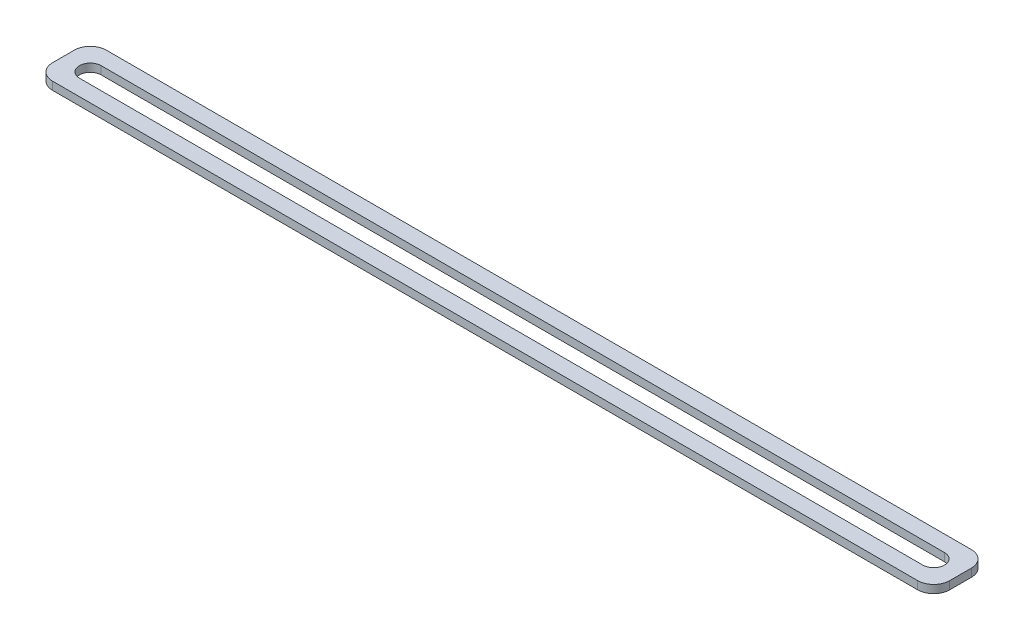
ISO-10303-21;
HEADER;
FILE_DESCRIPTION(('STEP AP214'),'2;1');
FILE_NAME('part.step','',(''),(''),'','','');
FILE_SCHEMA(('AUTOMOTIVE_DESIGN { 1 0 10303 214 1 1 1 1 }'));
ENDSEC;
DATA;
#1=APPLICATION_CONTEXT('core data for automotive mechanical design processes');
#2=APPLICATION_PROTOCOL_DEFINITION('international standard','automotive_design',2000,#1);
#3=PRODUCT_CONTEXT('',#1,'mechanical');
#4=PRODUCT('Part','Part','',(#3));
#5=PRODUCT_RELATED_PRODUCT_CATEGORY('part','',(#4));
#6=PRODUCT_DEFINITION_FORMATION('','',#4);
#7=PRODUCT_DEFINITION_CONTEXT('part definition',#1,'design');
#8=PRODUCT_DEFINITION('design','',#6,#7);
#9=PRODUCT_DEFINITION_SHAPE('','',#8);
#10=(LENGTH_UNIT() NAMED_UNIT(*) SI_UNIT(.MILLI.,.METRE.));
#11=(NAMED_UNIT(*) PLANE_ANGLE_UNIT() SI_UNIT($,.RADIAN.));
#12=(NAMED_UNIT(*) SI_UNIT($,.STERADIAN.) SOLID_ANGLE_UNIT());
#13=UNCERTAINTY_MEASURE_WITH_UNIT(LENGTH_MEASURE(1.E-05),#10,'distance_accuracy_value','');
#14=(GEOMETRIC_REPRESENTATION_CONTEXT(3) GLOBAL_UNCERTAINTY_ASSIGNED_CONTEXT((#13)) GLOBAL_UNIT_ASSIGNED_CONTEXT((#10,
#11,#12)) REPRESENTATION_CONTEXT('',''));
#15=CARTESIAN_POINT('',(0.,0.,0.));
#16=DIRECTION('',(0.,0.,1.));
#17=DIRECTION('',(1.,0.,0.));
#18=AXIS2_PLACEMENT_3D('',#15,#16,#17);
#19=CARTESIAN_POINT('',(0.,1.5875,0.));
#20=DIRECTION('',(0.,-1.,0.));
#21=DIRECTION('',(0.,0.,-1.));
#22=AXIS2_PLACEMENT_3D('',#19,#20,#21);
#23=PLANE('',#22);
#24=DIRECTION('',(0.,0.,-1.));
#25=VECTOR('',#24,1.);
#26=CARTESIAN_POINT('',(88.9,1.5875,5.325));
#27=LINE('',#26,#25);
#28=CARTESIAN_POINT('',(88.9,1.5875,2.15));
#29=VERTEX_POINT('',#28);
#30=CARTESIAN_POINT('',(88.9,1.5875,-2.15));
#31=VERTEX_POINT('',#30);
#32=EDGE_CURVE('E176',#29,#31,#27,.T.);
#33=ORIENTED_EDGE('',*,*,#32,.T.);
#34=CARTESIAN_POINT('',(85.725,1.5875,-2.15));
#35=DIRECTION('',(0.,-1.,0.));
#36=DIRECTION('',(0.,0.,-1.));
#37=AXIS2_PLACEMENT_3D('',#34,#35,#36);
#38=CIRCLE('',#37,3.175);
#39=CARTESIAN_POINT('',(85.725,1.5875,-5.325));
#40=VERTEX_POINT('',#39);
#41=EDGE_CURVE('E219',#31,#40,#38,.F.);
#42=ORIENTED_EDGE('',*,*,#41,.T.);
#43=DIRECTION('',(-1.,0.,0.));
#44=VECTOR('',#43,1.);
#45=CARTESIAN_POINT('',(-88.9,1.5875,-5.325));
#46=LINE('',#45,#44);
#47=CARTESIAN_POINT('',(-85.725,1.5875,-5.325));
#48=VERTEX_POINT('',#47);
#49=EDGE_CURVE('E179',#40,#48,#46,.T.);
#50=ORIENTED_EDGE('',*,*,#49,.T.);
#51=CARTESIAN_POINT('',(-85.725,1.5875,-2.15));
#52=DIRECTION('',(0.,-1.,0.));
#53=DIRECTION('',(0.,0.,-1.));
#54=AXIS2_PLACEMENT_3D('',#51,#52,#53);
#55=CIRCLE('',#54,3.175);
#56=CARTESIAN_POINT('',(-88.9,1.5875,-2.15));
#57=VERTEX_POINT('',#56);
#58=EDGE_CURVE('E215',#48,#57,#55,.F.);
#59=ORIENTED_EDGE('',*,*,#58,.T.);
#60=DIRECTION('',(0.,0.,1.));
#61=VECTOR('',#60,1.);
#62=CARTESIAN_POINT('',(-88.9,1.5875,5.325));
#63=LINE('',#62,#61);
#64=CARTESIAN_POINT('',(-88.9,1.5875,2.15));
#65=VERTEX_POINT('',#64);
#66=EDGE_CURVE('E183',#57,#65,#63,.T.);
#67=ORIENTED_EDGE('',*,*,#66,.T.);
#68=CARTESIAN_POINT('',(-85.725,1.5875,2.15));
#69=DIRECTION('',(0.,-1.,0.));
#70=DIRECTION('',(0.,0.,-1.));
#71=AXIS2_PLACEMENT_3D('',#68,#69,#70);
#72=CIRCLE('',#71,3.175);
#73=CARTESIAN_POINT('',(-85.725,1.5875,5.325));
#74=VERTEX_POINT('',#73);
#75=EDGE_CURVE('E65',#65,#74,#72,.F.);
#76=ORIENTED_EDGE('',*,*,#75,.T.);
#77=DIRECTION('',(1.,0.,0.));
#78=VECTOR('',#77,1.);
#79=CARTESIAN_POINT('',(-88.9,1.5875,5.325));
#80=LINE('',#79,#78);
#81=CARTESIAN_POINT('',(85.725,1.5875,5.325));
#82=VERTEX_POINT('',#81);
#83=EDGE_CURVE('E185',#74,#82,#80,.T.);
#84=ORIENTED_EDGE('',*,*,#83,.T.);
#85=CARTESIAN_POINT('',(85.725,1.5875,2.15));
#86=DIRECTION('',(0.,-1.,0.));
#87=DIRECTION('',(0.,0.,-1.));
#88=AXIS2_PLACEMENT_3D('',#85,#86,#87);
#89=CIRCLE('',#88,3.175);
#90=EDGE_CURVE('E217',#82,#29,#89,.F.);
#91=ORIENTED_EDGE('',*,*,#90,.T.);
#92=EDGE_LOOP('',(#33,#42,#50,#59,#67,#76,#84,#91));
#93=FACE_BOUND('',#92,.T.);
#94=CARTESIAN_POINT('',(-83.575,1.5875,0.));
#95=DIRECTION('',(0.,1.,0.));
#96=DIRECTION('',(0.,0.,1.));
#97=AXIS2_PLACEMENT_3D('',#94,#95,#96);
#98=CIRCLE('',#97,2.15);
#99=CARTESIAN_POINT('',(-83.575,1.5875,-2.15));
#100=VERTEX_POINT('',#99);
#101=CARTESIAN_POINT('',(-83.575,1.5875,2.15));
#102=VERTEX_POINT('',#101);
#103=EDGE_CURVE('E135',#100,#102,#98,.T.);
#104=ORIENTED_EDGE('',*,*,#103,.F.);
#105=DIRECTION('',(-1.,0.,0.));
#106=VECTOR('',#105,1.);
#107=CARTESIAN_POINT('',(-83.575,1.5875,-2.15));
#108=LINE('',#107,#106);
#109=CARTESIAN_POINT('',(83.575,1.5875,-2.15000000000003));
#110=VERTEX_POINT('',#109);
#111=EDGE_CURVE('E160',#110,#100,#108,.T.);
#112=ORIENTED_EDGE('',*,*,#111,.F.);
#113=CARTESIAN_POINT('',(83.575,1.5875,0.));
#114=DIRECTION('',(0.,1.,0.));
#115=DIRECTION('',(0.,0.,1.));
#116=AXIS2_PLACEMENT_3D('',#113,#114,#115);
#117=CIRCLE('',#116,2.15);
#118=CARTESIAN_POINT('',(83.575,1.5875,2.15));
#119=VERTEX_POINT('',#118);
#120=EDGE_CURVE('E158',#119,#110,#117,.T.);
#121=ORIENTED_EDGE('',*,*,#120,.F.);
#122=DIRECTION('',(1.,0.,0.));
#123=VECTOR('',#122,1.);
#124=CARTESIAN_POINT('',(-83.575,1.5875,2.15));
#125=LINE('',#124,#123);
#126=EDGE_CURVE('E145',#102,#119,#125,.T.);
#127=ORIENTED_EDGE('',*,*,#126,.F.);
#128=EDGE_LOOP('',(#104,#112,#121,#127));
#129=FACE_BOUND('',#128,.T.);
#130=ADVANCED_FACE('F43',(#93,#129),#23,.F.);
#131=CARTESIAN_POINT('',(0.,0.,0.));
#132=DIRECTION('',(0.,-1.,0.));
#133=DIRECTION('',(0.,0.,-1.));
#134=AXIS2_PLACEMENT_3D('',#131,#132,#133);
#135=PLANE('',#134);
#136=DIRECTION('',(-1.,0.,0.));
#137=VECTOR('',#136,1.);
#138=CARTESIAN_POINT('',(-88.9,0.,-5.325));
#139=LINE('',#138,#137);
#140=CARTESIAN_POINT('',(85.725,0.,-5.325));
#141=VERTEX_POINT('',#140);
#142=CARTESIAN_POINT('',(-85.725,0.,-5.325));
#143=VERTEX_POINT('',#142);
#144=EDGE_CURVE('E190',#141,#143,#139,.T.);
#145=ORIENTED_EDGE('',*,*,#144,.F.);
#146=CARTESIAN_POINT('',(85.725,0.,-2.15));
#147=DIRECTION('',(0.,-1.,0.));
#148=DIRECTION('',(0.,0.,-1.));
#149=AXIS2_PLACEMENT_3D('',#146,#147,#148);
#150=CIRCLE('',#149,3.175);
#151=CARTESIAN_POINT('',(88.9,0.,-2.15));
#152=VERTEX_POINT('',#151);
#153=EDGE_CURVE('E207',#141,#152,#150,.T.);
#154=ORIENTED_EDGE('',*,*,#153,.T.);
#155=DIRECTION('',(0.,0.,-1.));
#156=VECTOR('',#155,1.);
#157=CARTESIAN_POINT('',(88.9,0.,5.325));
#158=LINE('',#157,#156);
#159=CARTESIAN_POINT('',(88.9,0.,2.15));
#160=VERTEX_POINT('',#159);
#161=EDGE_CURVE('E153',#160,#152,#158,.T.);
#162=ORIENTED_EDGE('',*,*,#161,.F.);
#163=CARTESIAN_POINT('',(85.725,0.,2.15));
#164=DIRECTION('',(0.,-1.,0.));
#165=DIRECTION('',(0.,0.,-1.));
#166=AXIS2_PLACEMENT_3D('',#163,#164,#165);
#167=CIRCLE('',#166,3.175);
#168=CARTESIAN_POINT('',(85.725,0.,5.325));
#169=VERTEX_POINT('',#168);
#170=EDGE_CURVE('E205',#160,#169,#167,.T.);
#171=ORIENTED_EDGE('',*,*,#170,.T.);
#172=DIRECTION('',(1.,0.,0.));
#173=VECTOR('',#172,1.);
#174=CARTESIAN_POINT('',(-88.9,0.,5.325));
#175=LINE('',#174,#173);
#176=CARTESIAN_POINT('',(-85.725,0.,5.325));
#177=VERTEX_POINT('',#176);
#178=EDGE_CURVE('E180',#177,#169,#175,.T.);
#179=ORIENTED_EDGE('',*,*,#178,.F.);
#180=CARTESIAN_POINT('',(-85.725,0.,2.15));
#181=DIRECTION('',(0.,-1.,0.));
#182=DIRECTION('',(0.,0.,-1.));
#183=AXIS2_PLACEMENT_3D('',#180,#181,#182);
#184=CIRCLE('',#183,3.175);
#185=CARTESIAN_POINT('',(-88.9,0.,2.15));
#186=VERTEX_POINT('',#185);
#187=EDGE_CURVE('E201',#177,#186,#184,.T.);
#188=ORIENTED_EDGE('',*,*,#187,.T.);
#189=DIRECTION('',(0.,0.,1.));
#190=VECTOR('',#189,1.);
#191=CARTESIAN_POINT('',(-88.9,0.,5.325));
#192=LINE('',#191,#190);
#193=CARTESIAN_POINT('',(-88.9,0.,-2.15));
#194=VERTEX_POINT('',#193);
#195=EDGE_CURVE('E193',#194,#186,#192,.T.);
#196=ORIENTED_EDGE('',*,*,#195,.F.);
#197=CARTESIAN_POINT('',(-85.725,0.,-2.15));
#198=DIRECTION('',(0.,-1.,0.));
#199=DIRECTION('',(0.,0.,-1.));
#200=AXIS2_PLACEMENT_3D('',#197,#198,#199);
#201=CIRCLE('',#200,3.175);
#202=EDGE_CURVE('E203',#194,#143,#201,.T.);
#203=ORIENTED_EDGE('',*,*,#202,.T.);
#204=EDGE_LOOP('',(#145,#154,#162,#171,#179,#188,#196,#203));
#205=FACE_BOUND('',#204,.T.);
#206=DIRECTION('',(-1.,0.,0.));
#207=VECTOR('',#206,1.);
#208=CARTESIAN_POINT('',(-83.575,0.,-2.15));
#209=LINE('',#208,#207);
#210=CARTESIAN_POINT('',(83.575,0.,-2.15000000000003));
#211=VERTEX_POINT('',#210);
#212=CARTESIAN_POINT('',(-83.575,0.,-2.15));
#213=VERTEX_POINT('',#212);
#214=EDGE_CURVE('E146',#211,#213,#209,.T.);
#215=ORIENTED_EDGE('',*,*,#214,.T.);
#216=CARTESIAN_POINT('',(-83.575,0.,0.));
#217=DIRECTION('',(0.,1.,0.));
#218=DIRECTION('',(0.,0.,1.));
#219=AXIS2_PLACEMENT_3D('',#216,#217,#218);
#220=CIRCLE('',#219,2.15);
#221=CARTESIAN_POINT('',(-83.575,0.,2.15));
#222=VERTEX_POINT('',#221);
#223=EDGE_CURVE('E164',#213,#222,#220,.T.);
#224=ORIENTED_EDGE('',*,*,#223,.T.);
#225=DIRECTION('',(1.,0.,0.));
#226=VECTOR('',#225,1.);
#227=CARTESIAN_POINT('',(-83.575,0.,2.15));
#228=LINE('',#227,#226);
#229=CARTESIAN_POINT('',(83.575,0.,2.15));
#230=VERTEX_POINT('',#229);
#231=EDGE_CURVE('E152',#222,#230,#228,.T.);
#232=ORIENTED_EDGE('',*,*,#231,.T.);
#233=CARTESIAN_POINT('',(83.575,0.,0.));
#234=DIRECTION('',(0.,1.,0.));
#235=DIRECTION('',(0.,0.,1.));
#236=AXIS2_PLACEMENT_3D('',#233,#234,#235);
#237=CIRCLE('',#236,2.15);
#238=EDGE_CURVE('E167',#230,#211,#237,.T.);
#239=ORIENTED_EDGE('',*,*,#238,.T.);
#240=EDGE_LOOP('',(#215,#224,#232,#239));
#241=FACE_BOUND('',#240,.T.);
#242=ADVANCED_FACE('F237',(#205,#241),#135,.T.);
#243=CARTESIAN_POINT('',(88.9,1.5875,5.325));
#244=DIRECTION('',(-1.,0.,0.));
#245=DIRECTION('',(0.,0.,1.));
#246=AXIS2_PLACEMENT_3D('',#243,#244,#245);
#247=PLANE('',#246);
#248=ORIENTED_EDGE('',*,*,#161,.T.);
#249=DIRECTION('',(0.,-1.,0.));
#250=VECTOR('',#249,1.);
#251=CARTESIAN_POINT('',(88.9,1.5875,-2.15));
#252=LINE('',#251,#250);
#253=EDGE_CURVE('E212',#152,#31,#252,.F.);
#254=ORIENTED_EDGE('',*,*,#253,.T.);
#255=ORIENTED_EDGE('',*,*,#32,.F.);
#256=DIRECTION('',(0.,-1.,0.));
#257=VECTOR('',#256,1.);
#258=CARTESIAN_POINT('',(88.9,1.5875,2.15));
#259=LINE('',#258,#257);
#260=EDGE_CURVE('E209',#29,#160,#259,.T.);
#261=ORIENTED_EDGE('',*,*,#260,.T.);
#262=EDGE_LOOP('',(#248,#254,#255,#261));
#263=FACE_BOUND('',#262,.T.);
#264=ADVANCED_FACE('F246',(#263),#247,.F.);
#265=CARTESIAN_POINT('',(-88.9,1.5875,-5.325));
#266=DIRECTION('',(0.,0.,1.));
#267=DIRECTION('',(1.,0.,0.));
#268=AXIS2_PLACEMENT_3D('',#265,#266,#267);
#269=PLANE('',#268);
#270=ORIENTED_EDGE('',*,*,#49,.F.);
#271=DIRECTION('',(0.,-1.,0.));
#272=VECTOR('',#271,1.);
#273=CARTESIAN_POINT('',(85.725,1.5875,-5.325));
#274=LINE('',#273,#272);
#275=EDGE_CURVE('E198',#40,#141,#274,.T.);
#276=ORIENTED_EDGE('',*,*,#275,.T.);
#277=ORIENTED_EDGE('',*,*,#144,.T.);
#278=DIRECTION('',(0.,-1.,0.));
#279=VECTOR('',#278,1.);
#280=CARTESIAN_POINT('',(-85.725,1.5875,-5.325));
#281=LINE('',#280,#279);
#282=EDGE_CURVE('E187',#143,#48,#281,.F.);
#283=ORIENTED_EDGE('',*,*,#282,.T.);
#284=EDGE_LOOP('',(#270,#276,#277,#283));
#285=FACE_BOUND('',#284,.T.);
#286=ADVANCED_FACE('F254',(#285),#269,.F.);
#287=CARTESIAN_POINT('',(-88.9,1.5875,5.325));
#288=DIRECTION('',(1.,0.,0.));
#289=DIRECTION('',(0.,0.,-1.));
#290=AXIS2_PLACEMENT_3D('',#287,#288,#289);
#291=PLANE('',#290);
#292=ORIENTED_EDGE('',*,*,#66,.F.);
#293=DIRECTION('',(0.,-1.,0.));
#294=VECTOR('',#293,1.);
#295=CARTESIAN_POINT('',(-88.9,1.5875,-2.15));
#296=LINE('',#295,#294);
#297=EDGE_CURVE('E11',#57,#194,#296,.T.);
#298=ORIENTED_EDGE('',*,*,#297,.T.);
#299=ORIENTED_EDGE('',*,*,#195,.T.);
#300=DIRECTION('',(0.,-1.,0.));
#301=VECTOR('',#300,1.);
#302=CARTESIAN_POINT('',(-88.9,1.5875,2.15));
#303=LINE('',#302,#301);
#304=EDGE_CURVE('E51',#186,#65,#303,.F.);
#305=ORIENTED_EDGE('',*,*,#304,.T.);
#306=EDGE_LOOP('',(#292,#298,#299,#305));
#307=FACE_BOUND('',#306,.T.);
#308=ADVANCED_FACE('F227',(#307),#291,.F.);
#309=CARTESIAN_POINT('',(-88.9,1.5875,5.325));
#310=DIRECTION('',(0.,0.,-1.));
#311=DIRECTION('',(-1.,0.,0.));
#312=AXIS2_PLACEMENT_3D('',#309,#310,#311);
#313=PLANE('',#312);
#314=ORIENTED_EDGE('',*,*,#178,.T.);
#315=DIRECTION('',(0.,-1.,0.));
#316=VECTOR('',#315,1.);
#317=CARTESIAN_POINT('',(85.725,1.5875,5.325));
#318=LINE('',#317,#316);
#319=EDGE_CURVE('E58',#169,#82,#318,.F.);
#320=ORIENTED_EDGE('',*,*,#319,.T.);
#321=ORIENTED_EDGE('',*,*,#83,.F.);
#322=DIRECTION('',(0.,-1.,0.));
#323=VECTOR('',#322,1.);
#324=CARTESIAN_POINT('',(-85.725,1.5875,5.325));
#325=LINE('',#324,#323);
#326=EDGE_CURVE('E221',#74,#177,#325,.T.);
#327=ORIENTED_EDGE('',*,*,#326,.T.);
#328=EDGE_LOOP('',(#314,#320,#321,#327));
#329=FACE_BOUND('',#328,.T.);
#330=ADVANCED_FACE('F234',(#329),#313,.F.);
#331=CARTESIAN_POINT('',(-83.575,1.5875,0.));
#332=DIRECTION('',(0.,-1.,0.));
#333=DIRECTION('',(0.,0.,-1.));
#334=AXIS2_PLACEMENT_3D('',#331,#332,#333);
#335=CYLINDRICAL_SURFACE('',#334,2.15);
#336=ORIENTED_EDGE('',*,*,#223,.F.);
#337=DIRECTION('',(0.,-1.,0.));
#338=VECTOR('',#337,1.);
#339=CARTESIAN_POINT('',(-83.575,1.5875,-2.15));
#340=LINE('',#339,#338);
#341=EDGE_CURVE('E141',#100,#213,#340,.T.);
#342=ORIENTED_EDGE('',*,*,#341,.F.);
#343=ORIENTED_EDGE('',*,*,#103,.T.);
#344=DIRECTION('',(0.,-1.,0.));
#345=VECTOR('',#344,1.);
#346=CARTESIAN_POINT('',(-83.575,1.5875,2.15));
#347=LINE('',#346,#345);
#348=EDGE_CURVE('E138',#102,#222,#347,.T.);
#349=ORIENTED_EDGE('',*,*,#348,.T.);
#350=EDGE_LOOP('',(#336,#342,#343,#349));
#351=FACE_BOUND('',#350,.T.);
#352=ADVANCED_FACE('F137',(#351),#335,.F.);
#353=CARTESIAN_POINT('',(-83.575,1.5875,2.15));
#354=DIRECTION('',(0.,0.,-1.));
#355=DIRECTION('',(-1.,0.,0.));
#356=AXIS2_PLACEMENT_3D('',#353,#354,#355);
#357=PLANE('',#356);
#358=ORIENTED_EDGE('',*,*,#231,.F.);
#359=ORIENTED_EDGE('',*,*,#348,.F.);
#360=ORIENTED_EDGE('',*,*,#126,.T.);
#361=DIRECTION('',(0.,-1.,0.));
#362=VECTOR('',#361,1.);
#363=CARTESIAN_POINT('',(83.575,1.5875,2.15));
#364=LINE('',#363,#362);
#365=EDGE_CURVE('E154',#119,#230,#364,.T.);
#366=ORIENTED_EDGE('',*,*,#365,.T.);
#367=EDGE_LOOP('',(#358,#359,#360,#366));
#368=FACE_BOUND('',#367,.T.);
#369=ADVANCED_FACE('F149',(#368),#357,.T.);
#370=CARTESIAN_POINT('',(83.575,1.5875,0.));
#371=DIRECTION('',(0.,-1.,0.));
#372=DIRECTION('',(0.,0.,-1.));
#373=AXIS2_PLACEMENT_3D('',#370,#371,#372);
#374=CYLINDRICAL_SURFACE('',#373,2.15);
#375=ORIENTED_EDGE('',*,*,#238,.F.);
#376=ORIENTED_EDGE('',*,*,#365,.F.);
#377=ORIENTED_EDGE('',*,*,#120,.T.);
#378=DIRECTION('',(0.,-1.,0.));
#379=VECTOR('',#378,1.);
#380=CARTESIAN_POINT('',(83.575,1.5875,-2.15000000000003));
#381=LINE('',#380,#379);
#382=EDGE_CURVE('E173',#110,#211,#381,.T.);
#383=ORIENTED_EDGE('',*,*,#382,.T.);
#384=EDGE_LOOP('',(#375,#376,#377,#383));
#385=FACE_BOUND('',#384,.T.);
#386=ADVANCED_FACE('F286',(#385),#374,.F.);
#387=CARTESIAN_POINT('',(-83.575,1.5875,-2.15));
#388=DIRECTION('',(0.,0.,1.));
#389=DIRECTION('',(1.,0.,0.));
#390=AXIS2_PLACEMENT_3D('',#387,#388,#389);
#391=PLANE('',#390);
#392=ORIENTED_EDGE('',*,*,#214,.F.);
#393=ORIENTED_EDGE('',*,*,#382,.F.);
#394=ORIENTED_EDGE('',*,*,#111,.T.);
#395=ORIENTED_EDGE('',*,*,#341,.T.);
#396=EDGE_LOOP('',(#392,#393,#394,#395));
#397=FACE_BOUND('',#396,.T.);
#398=ADVANCED_FACE('F283',(#397),#391,.T.);
#399=CARTESIAN_POINT('',(85.725,1.5875,-2.15));
#400=DIRECTION('',(0.,-1.,0.));
#401=DIRECTION('',(0.,0.,-1.));
#402=AXIS2_PLACEMENT_3D('',#399,#400,#401);
#403=CYLINDRICAL_SURFACE('',#402,3.175);
#404=ORIENTED_EDGE('',*,*,#41,.F.);
#405=ORIENTED_EDGE('',*,*,#253,.F.);
#406=ORIENTED_EDGE('',*,*,#153,.F.);
#407=ORIENTED_EDGE('',*,*,#275,.F.);
#408=EDGE_LOOP('',(#404,#405,#406,#407));
#409=FACE_BOUND('',#408,.T.);
#410=ADVANCED_FACE('F252',(#409),#403,.T.);
#411=CARTESIAN_POINT('',(85.725,1.5875,2.15));
#412=DIRECTION('',(0.,-1.,0.));
#413=DIRECTION('',(0.,0.,-1.));
#414=AXIS2_PLACEMENT_3D('',#411,#412,#413);
#415=CYLINDRICAL_SURFACE('',#414,3.175);
#416=ORIENTED_EDGE('',*,*,#90,.F.);
#417=ORIENTED_EDGE('',*,*,#319,.F.);
#418=ORIENTED_EDGE('',*,*,#170,.F.);
#419=ORIENTED_EDGE('',*,*,#260,.F.);
#420=EDGE_LOOP('',(#416,#417,#418,#419));
#421=FACE_BOUND('',#420,.T.);
#422=ADVANCED_FACE('F243',(#421),#415,.T.);
#423=CARTESIAN_POINT('',(-85.725,1.5875,-2.15));
#424=DIRECTION('',(0.,-1.,0.));
#425=DIRECTION('',(0.,0.,-1.));
#426=AXIS2_PLACEMENT_3D('',#423,#424,#425);
#427=CYLINDRICAL_SURFACE('',#426,3.175);
#428=ORIENTED_EDGE('',*,*,#58,.F.);
#429=ORIENTED_EDGE('',*,*,#282,.F.);
#430=ORIENTED_EDGE('',*,*,#202,.F.);
#431=ORIENTED_EDGE('',*,*,#297,.F.);
#432=EDGE_LOOP('',(#428,#429,#430,#431));
#433=FACE_BOUND('',#432,.T.);
#434=ADVANCED_FACE('F257',(#433),#427,.T.);
#435=CARTESIAN_POINT('',(-85.725,1.5875,2.15));
#436=DIRECTION('',(0.,-1.,0.));
#437=DIRECTION('',(0.,0.,-1.));
#438=AXIS2_PLACEMENT_3D('',#435,#436,#437);
#439=CYLINDRICAL_SURFACE('',#438,3.175);
#440=ORIENTED_EDGE('',*,*,#75,.F.);
#441=ORIENTED_EDGE('',*,*,#304,.F.);
#442=ORIENTED_EDGE('',*,*,#187,.F.);
#443=ORIENTED_EDGE('',*,*,#326,.F.);
#444=EDGE_LOOP('',(#440,#441,#442,#443));
#445=FACE_BOUND('',#444,.T.);
#446=ADVANCED_FACE('F45',(#445),#439,.T.);
#447=CLOSED_SHELL('',(#130,#242,#264,#286,#308,#330,#352,#369,#386,#398,#410,#422,#434,#446));
#448=MANIFOLD_SOLID_BREP('B2',#447);
#449=ADVANCED_BREP_SHAPE_REPRESENTATION('',(#18,#448),#14);
#450=SHAPE_DEFINITION_REPRESENTATION(#9,#449);
ENDSEC;
END-ISO-10303-21;
